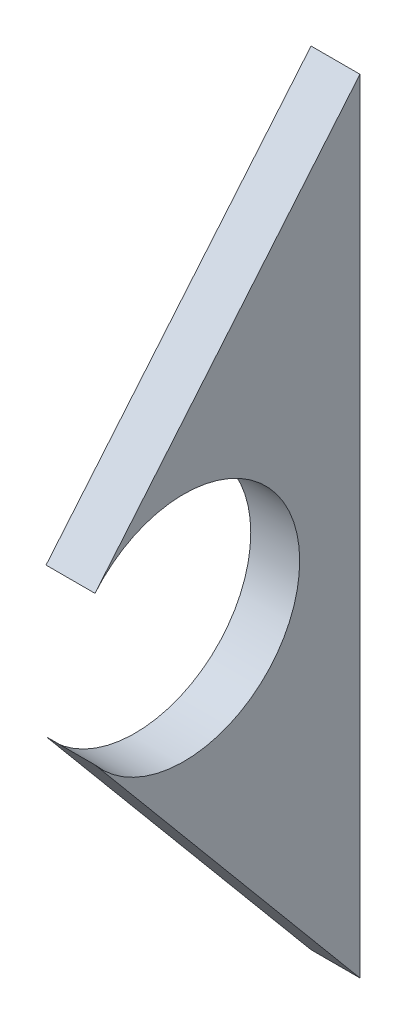
ISO-10303-21;
HEADER;
FILE_DESCRIPTION(('STEP AP214'),'2;1');
FILE_NAME('part.step','',(''),(''),'','','');
FILE_SCHEMA(('AUTOMOTIVE_DESIGN { 1 0 10303 214 1 1 1 1 }'));
ENDSEC;
DATA;
#1=APPLICATION_CONTEXT('core data for automotive mechanical design processes');
#2=APPLICATION_PROTOCOL_DEFINITION('international standard','automotive_design',2000,#1);
#3=PRODUCT_CONTEXT('',#1,'mechanical');
#4=PRODUCT('Part','Part','',(#3));
#5=PRODUCT_RELATED_PRODUCT_CATEGORY('part','',(#4));
#6=PRODUCT_DEFINITION_FORMATION('','',#4);
#7=PRODUCT_DEFINITION_CONTEXT('part definition',#1,'design');
#8=PRODUCT_DEFINITION('design','',#6,#7);
#9=PRODUCT_DEFINITION_SHAPE('','',#8);
#10=(LENGTH_UNIT() NAMED_UNIT(*) SI_UNIT(.MILLI.,.METRE.));
#11=(NAMED_UNIT(*) PLANE_ANGLE_UNIT() SI_UNIT($,.RADIAN.));
#12=(NAMED_UNIT(*) SI_UNIT($,.STERADIAN.) SOLID_ANGLE_UNIT());
#13=UNCERTAINTY_MEASURE_WITH_UNIT(LENGTH_MEASURE(1.E-05),#10,'distance_accuracy_value','');
#14=(GEOMETRIC_REPRESENTATION_CONTEXT(3) GLOBAL_UNCERTAINTY_ASSIGNED_CONTEXT((#13)) GLOBAL_UNIT_ASSIGNED_CONTEXT((#10,
#11,#12)) REPRESENTATION_CONTEXT('',''));
#15=CARTESIAN_POINT('',(0.,0.,0.));
#16=DIRECTION('',(0.,0.,1.));
#17=DIRECTION('',(1.,0.,0.));
#18=AXIS2_PLACEMENT_3D('',#15,#16,#17);
#19=CARTESIAN_POINT('',(1.5875,12.7,-5.71499999999991));
#20=DIRECTION('',(0.,0.,1.));
#21=DIRECTION('',(1.,0.,0.));
#22=AXIS2_PLACEMENT_3D('',#19,#20,#21);
#23=PLANE('',#22);
#24=DIRECTION('',(0.,1.,0.));
#25=VECTOR('',#24,1.);
#26=CARTESIAN_POINT('',(0.,12.7,-5.71499999999991));
#27=LINE('',#26,#25);
#28=CARTESIAN_POINT('',(0.,-12.7,-5.71499999999991));
#29=VERTEX_POINT('',#28);
#30=CARTESIAN_POINT('',(0.,12.7,-5.71499999999991));
#31=VERTEX_POINT('',#30);
#32=EDGE_CURVE('E94',#29,#31,#27,.T.);
#33=ORIENTED_EDGE('',*,*,#32,.T.);
#34=DIRECTION('',(-1.,0.,0.));
#35=VECTOR('',#34,1.);
#36=CARTESIAN_POINT('',(1.5875,12.7,-5.71499999999991));
#37=LINE('',#36,#35);
#38=CARTESIAN_POINT('',(1.5875,12.7,-5.71499999999991));
#39=VERTEX_POINT('',#38);
#40=EDGE_CURVE('E11',#39,#31,#37,.T.);
#41=ORIENTED_EDGE('',*,*,#40,.F.);
#42=DIRECTION('',(0.,1.,0.));
#43=VECTOR('',#42,1.);
#44=CARTESIAN_POINT('',(1.5875,12.7,-5.71499999999991));
#45=LINE('',#44,#43);
#46=CARTESIAN_POINT('',(1.5875,-12.7,-5.71499999999991));
#47=VERTEX_POINT('',#46);
#48=EDGE_CURVE('E82',#47,#39,#45,.T.);
#49=ORIENTED_EDGE('',*,*,#48,.F.);
#50=DIRECTION('',(-1.,0.,0.));
#51=VECTOR('',#50,1.);
#52=CARTESIAN_POINT('',(1.5875,-12.7,-5.71499999999991));
#53=LINE('',#52,#51);
#54=EDGE_CURVE('E90',#47,#29,#53,.T.);
#55=ORIENTED_EDGE('',*,*,#54,.T.);
#56=EDGE_LOOP('',(#33,#41,#49,#55));
#57=FACE_BOUND('',#56,.T.);
#58=ADVANCED_FACE('F31',(#57),#23,.F.);
#59=CARTESIAN_POINT('',(1.5875,2.41072198352299,2.88444174116223));
#60=DIRECTION('',(0.,-0.641285907513031,-0.767302016695635));
#61=DIRECTION('',(0.,0.767302016695635,-0.641285907513031));
#62=AXIS2_PLACEMENT_3D('',#59,#60,#61);
#63=PLANE('',#62);
#64=DIRECTION('',(0.,-0.767302016695635,0.641285907513031));
#65=VECTOR('',#64,1.);
#66=CARTESIAN_POINT('',(0.,2.41072198352299,2.88444174116223));
#67=LINE('',#66,#65);
#68=CARTESIAN_POINT('',(0.,2.41072198352299,2.88444174116223));
#69=VERTEX_POINT('',#68);
#70=EDGE_CURVE('E86',#31,#69,#67,.T.);
#71=ORIENTED_EDGE('',*,*,#70,.T.);
#72=DIRECTION('',(-1.,0.,0.));
#73=VECTOR('',#72,1.);
#74=CARTESIAN_POINT('',(1.5875,2.41072198352299,2.88444174116223));
#75=LINE('',#74,#73);
#76=CARTESIAN_POINT('',(1.5875,2.41072198352299,2.88444174116223));
#77=VERTEX_POINT('',#76);
#78=EDGE_CURVE('E39',#77,#69,#75,.T.);
#79=ORIENTED_EDGE('',*,*,#78,.F.);
#80=DIRECTION('',(0.,-0.767302016695635,0.641285907513031));
#81=VECTOR('',#80,1.);
#82=CARTESIAN_POINT('',(1.5875,2.41072198352299,2.88444174116223));
#83=LINE('',#82,#81);
#84=EDGE_CURVE('E77',#39,#77,#83,.T.);
#85=ORIENTED_EDGE('',*,*,#84,.F.);
#86=ORIENTED_EDGE('',*,*,#40,.T.);
#87=EDGE_LOOP('',(#71,#79,#85,#86));
#88=FACE_BOUND('',#87,.T.);
#89=ADVANCED_FACE('F85',(#88),#63,.F.);
#90=CARTESIAN_POINT('',(1.5875,0.,0.));
#91=DIRECTION('',(-1.,0.,0.));
#92=DIRECTION('',(0.,0.,1.));
#93=AXIS2_PLACEMENT_3D('',#90,#91,#92);
#94=CYLINDRICAL_SURFACE('',#93,3.7592);
#95=CARTESIAN_POINT('',(0.,0.,0.));
#96=DIRECTION('',(-1.,0.,0.));
#97=DIRECTION('',(0.,0.,-1.));
#98=AXIS2_PLACEMENT_3D('',#95,#96,#97);
#99=CIRCLE('',#98,3.7592);
#100=CARTESIAN_POINT('',(0.,-2.41072198352299,2.88444174116223));
#101=VERTEX_POINT('',#100);
#102=EDGE_CURVE('E64',#69,#101,#99,.T.);
#103=ORIENTED_EDGE('',*,*,#102,.T.);
#104=DIRECTION('',(-1.,0.,0.));
#105=VECTOR('',#104,1.);
#106=CARTESIAN_POINT('',(1.5875,-2.41072198352299,2.88444174116223));
#107=LINE('',#106,#105);
#108=CARTESIAN_POINT('',(1.5875,-2.41072198352299,2.88444174116223));
#109=VERTEX_POINT('',#108);
#110=EDGE_CURVE('E87',#109,#101,#107,.T.);
#111=ORIENTED_EDGE('',*,*,#110,.F.);
#112=CARTESIAN_POINT('',(1.5875,0.,0.));
#113=DIRECTION('',(-1.,0.,0.));
#114=DIRECTION('',(0.,0.,-1.));
#115=AXIS2_PLACEMENT_3D('',#112,#113,#114);
#116=CIRCLE('',#115,3.7592);
#117=EDGE_CURVE('E80',#77,#109,#116,.T.);
#118=ORIENTED_EDGE('',*,*,#117,.F.);
#119=ORIENTED_EDGE('',*,*,#78,.T.);
#120=EDGE_LOOP('',(#103,#111,#118,#119));
#121=FACE_BOUND('',#120,.T.);
#122=ADVANCED_FACE('F88',(#121),#94,.F.);
#123=CARTESIAN_POINT('',(1.5875,-12.7,-5.71499999999991));
#124=DIRECTION('',(0.,0.641285907513031,-0.767302016695635));
#125=DIRECTION('',(0.,0.767302016695635,0.641285907513031));
#126=AXIS2_PLACEMENT_3D('',#123,#124,#125);
#127=PLANE('',#126);
#128=DIRECTION('',(0.,-0.767302016695635,-0.641285907513031));
#129=VECTOR('',#128,1.);
#130=CARTESIAN_POINT('',(0.,-12.7,-5.71499999999991));
#131=LINE('',#130,#129);
#132=EDGE_CURVE('E70',#101,#29,#131,.T.);
#133=ORIENTED_EDGE('',*,*,#132,.T.);
#134=ORIENTED_EDGE('',*,*,#54,.F.);
#135=DIRECTION('',(0.,-0.767302016695635,-0.641285907513031));
#136=VECTOR('',#135,1.);
#137=CARTESIAN_POINT('',(1.5875,-12.7,-5.71499999999991));
#138=LINE('',#137,#136);
#139=EDGE_CURVE('E47',#109,#47,#138,.T.);
#140=ORIENTED_EDGE('',*,*,#139,.F.);
#141=ORIENTED_EDGE('',*,*,#110,.T.);
#142=EDGE_LOOP('',(#133,#134,#140,#141));
#143=FACE_BOUND('',#142,.T.);
#144=ADVANCED_FACE('F101',(#143),#127,.F.);
#145=CARTESIAN_POINT('',(1.5875,0.,0.));
#146=DIRECTION('',(1.,0.,0.));
#147=DIRECTION('',(0.,0.,-1.));
#148=AXIS2_PLACEMENT_3D('',#145,#146,#147);
#149=PLANE('',#148);
#150=ORIENTED_EDGE('',*,*,#48,.T.);
#151=ORIENTED_EDGE('',*,*,#84,.T.);
#152=ORIENTED_EDGE('',*,*,#117,.T.);
#153=ORIENTED_EDGE('',*,*,#139,.T.);
#154=EDGE_LOOP('',(#150,#151,#152,#153));
#155=FACE_BOUND('',#154,.T.);
#156=ADVANCED_FACE('F78',(#155),#149,.T.);
#157=CARTESIAN_POINT('',(0.,0.,0.));
#158=DIRECTION('',(1.,0.,0.));
#159=DIRECTION('',(0.,0.,-1.));
#160=AXIS2_PLACEMENT_3D('',#157,#158,#159);
#161=PLANE('',#160);
#162=ORIENTED_EDGE('',*,*,#32,.F.);
#163=ORIENTED_EDGE('',*,*,#132,.F.);
#164=ORIENTED_EDGE('',*,*,#102,.F.);
#165=ORIENTED_EDGE('',*,*,#70,.F.);
#166=EDGE_LOOP('',(#162,#163,#164,#165));
#167=FACE_BOUND('',#166,.T.);
#168=ADVANCED_FACE('F104',(#167),#161,.F.);
#169=CLOSED_SHELL('',(#58,#89,#122,#144,#156,#168));
#170=MANIFOLD_SOLID_BREP('B2',#169);
#171=ADVANCED_BREP_SHAPE_REPRESENTATION('',(#18,#170),#14);
#172=SHAPE_DEFINITION_REPRESENTATION(#9,#171);
ENDSEC;
END-ISO-10303-21;
